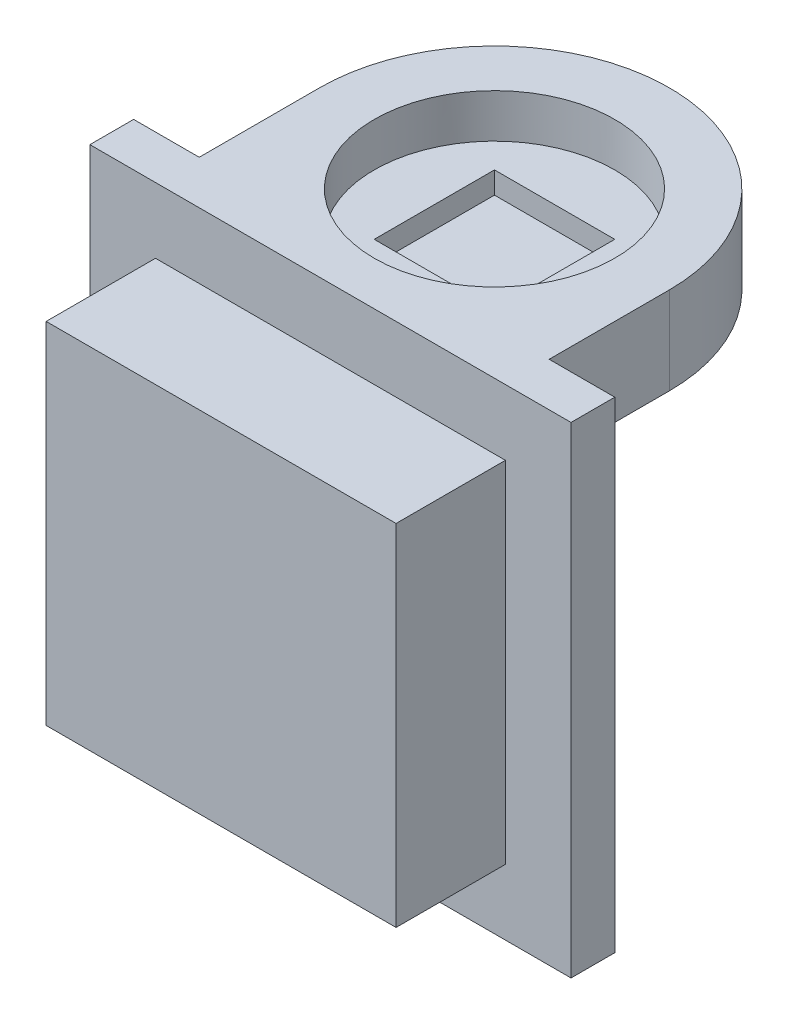
ISO-10303-21;
HEADER;
FILE_DESCRIPTION(('STEP AP214'),'2;1');
FILE_NAME('part.step','',(''),(''),'','','');
FILE_SCHEMA(('AUTOMOTIVE_DESIGN { 1 0 10303 214 1 1 1 1 }'));
ENDSEC;
DATA;
#1=APPLICATION_CONTEXT('core data for automotive mechanical design processes');
#2=APPLICATION_PROTOCOL_DEFINITION('international standard','automotive_design',2000,#1);
#3=PRODUCT_CONTEXT('',#1,'mechanical');
#4=PRODUCT('Part','Part','',(#3));
#5=PRODUCT_RELATED_PRODUCT_CATEGORY('part','',(#4));
#6=PRODUCT_DEFINITION_FORMATION('','',#4);
#7=PRODUCT_DEFINITION_CONTEXT('part definition',#1,'design');
#8=PRODUCT_DEFINITION('design','',#6,#7);
#9=PRODUCT_DEFINITION_SHAPE('','',#8);
#10=(LENGTH_UNIT() NAMED_UNIT(*) SI_UNIT(.MILLI.,.METRE.));
#11=(NAMED_UNIT(*) PLANE_ANGLE_UNIT() SI_UNIT($,.RADIAN.));
#12=(NAMED_UNIT(*) SI_UNIT($,.STERADIAN.) SOLID_ANGLE_UNIT());
#13=UNCERTAINTY_MEASURE_WITH_UNIT(LENGTH_MEASURE(1.E-05),#10,'distance_accuracy_value','');
#14=(GEOMETRIC_REPRESENTATION_CONTEXT(3) GLOBAL_UNCERTAINTY_ASSIGNED_CONTEXT((#13)) GLOBAL_UNIT_ASSIGNED_CONTEXT((#10,
#11,#12)) REPRESENTATION_CONTEXT('',''));
#15=CARTESIAN_POINT('',(0.,0.,0.));
#16=DIRECTION('',(0.,0.,1.));
#17=DIRECTION('',(1.,0.,0.));
#18=AXIS2_PLACEMENT_3D('',#15,#16,#17);
#19=CARTESIAN_POINT('',(2.75,9.,-13.75));
#20=DIRECTION('',(1.,0.,0.));
#21=DIRECTION('',(0.,0.,-1.));
#22=AXIS2_PLACEMENT_3D('',#19,#20,#21);
#23=PLANE('',#22);
#24=DIRECTION('',(0.,0.,1.));
#25=VECTOR('',#24,1.);
#26=CARTESIAN_POINT('',(2.75,8.,-13.75));
#27=LINE('',#26,#25);
#28=CARTESIAN_POINT('',(2.75,8.,-13.75));
#29=VERTEX_POINT('',#28);
#30=CARTESIAN_POINT('',(2.75,8.,-8.25));
#31=VERTEX_POINT('',#30);
#32=EDGE_CURVE('E193',#29,#31,#27,.T.);
#33=ORIENTED_EDGE('',*,*,#32,.T.);
#34=DIRECTION('',(0.,-1.,0.));
#35=VECTOR('',#34,1.);
#36=CARTESIAN_POINT('',(2.75,9.,-8.25));
#37=LINE('',#36,#35);
#38=CARTESIAN_POINT('',(2.75,9.,-8.25));
#39=VERTEX_POINT('',#38);
#40=EDGE_CURVE('E177',#39,#31,#37,.T.);
#41=ORIENTED_EDGE('',*,*,#40,.F.);
#42=DIRECTION('',(0.,0.,1.));
#43=VECTOR('',#42,1.);
#44=CARTESIAN_POINT('',(2.75,9.,-13.75));
#45=LINE('',#44,#43);
#46=CARTESIAN_POINT('',(2.75,9.,-13.75));
#47=VERTEX_POINT('',#46);
#48=EDGE_CURVE('E206',#47,#39,#45,.T.);
#49=ORIENTED_EDGE('',*,*,#48,.F.);
#50=DIRECTION('',(0.,-1.,0.));
#51=VECTOR('',#50,1.);
#52=CARTESIAN_POINT('',(2.75,9.,-13.75));
#53=LINE('',#52,#51);
#54=EDGE_CURVE('E194',#47,#29,#53,.T.);
#55=ORIENTED_EDGE('',*,*,#54,.T.);
#56=EDGE_LOOP('',(#33,#41,#49,#55));
#57=FACE_BOUND('',#56,.T.);
#58=ADVANCED_FACE('F39',(#57),#23,.F.);
#59=CARTESIAN_POINT('',(-2.75,9.,-13.75));
#60=DIRECTION('',(0.,0.,-1.));
#61=DIRECTION('',(-1.,0.,0.));
#62=AXIS2_PLACEMENT_3D('',#59,#60,#61);
#63=PLANE('',#62);
#64=DIRECTION('',(1.,0.,0.));
#65=VECTOR('',#64,1.);
#66=CARTESIAN_POINT('',(-2.75,8.,-13.75));
#67=LINE('',#66,#65);
#68=CARTESIAN_POINT('',(-2.75,8.,-13.75));
#69=VERTEX_POINT('',#68);
#70=EDGE_CURVE('E55',#69,#29,#67,.T.);
#71=ORIENTED_EDGE('',*,*,#70,.T.);
#72=ORIENTED_EDGE('',*,*,#54,.F.);
#73=DIRECTION('',(1.,0.,0.));
#74=VECTOR('',#73,1.);
#75=CARTESIAN_POINT('',(-2.75,9.,-13.75));
#76=LINE('',#75,#74);
#77=CARTESIAN_POINT('',(-2.75,9.,-13.75));
#78=VERTEX_POINT('',#77);
#79=EDGE_CURVE('E190',#78,#47,#76,.T.);
#80=ORIENTED_EDGE('',*,*,#79,.F.);
#81=DIRECTION('',(0.,-1.,0.));
#82=VECTOR('',#81,1.);
#83=CARTESIAN_POINT('',(-2.75,9.,-13.75));
#84=LINE('',#83,#82);
#85=EDGE_CURVE('E221',#78,#69,#84,.T.);
#86=ORIENTED_EDGE('',*,*,#85,.T.);
#87=EDGE_LOOP('',(#71,#72,#80,#86));
#88=FACE_BOUND('',#87,.T.);
#89=ADVANCED_FACE('F448',(#88),#63,.F.);
#90=CARTESIAN_POINT('',(-2.75,9.,-13.75));
#91=DIRECTION('',(-1.,0.,0.));
#92=DIRECTION('',(0.,0.,1.));
#93=AXIS2_PLACEMENT_3D('',#90,#91,#92);
#94=PLANE('',#93);
#95=DIRECTION('',(0.,0.,-1.));
#96=VECTOR('',#95,1.);
#97=CARTESIAN_POINT('',(-2.75,8.,-8.25));
#98=LINE('',#97,#96);
#99=CARTESIAN_POINT('',(-2.75,8.,-8.25));
#100=VERTEX_POINT('',#99);
#101=EDGE_CURVE('E63',#100,#69,#98,.T.);
#102=ORIENTED_EDGE('',*,*,#101,.T.);
#103=ORIENTED_EDGE('',*,*,#85,.F.);
#104=DIRECTION('',(0.,0.,-1.));
#105=VECTOR('',#104,1.);
#106=CARTESIAN_POINT('',(-2.75,9.,-13.75));
#107=LINE('',#106,#105);
#108=CARTESIAN_POINT('',(-2.75,9.,-8.25));
#109=VERTEX_POINT('',#108);
#110=EDGE_CURVE('E211',#109,#78,#107,.T.);
#111=ORIENTED_EDGE('',*,*,#110,.F.);
#112=DIRECTION('',(0.,-1.,0.));
#113=VECTOR('',#112,1.);
#114=CARTESIAN_POINT('',(-2.75,9.,-8.25));
#115=LINE('',#114,#113);
#116=EDGE_CURVE('E189',#109,#100,#115,.T.);
#117=ORIENTED_EDGE('',*,*,#116,.T.);
#118=EDGE_LOOP('',(#102,#103,#111,#117));
#119=FACE_BOUND('',#118,.T.);
#120=ADVANCED_FACE('F453',(#119),#94,.F.);
#121=CARTESIAN_POINT('',(-2.75,9.,-8.25));
#122=DIRECTION('',(0.,0.,1.));
#123=DIRECTION('',(1.,0.,0.));
#124=AXIS2_PLACEMENT_3D('',#121,#122,#123);
#125=PLANE('',#124);
#126=DIRECTION('',(-1.,0.,0.));
#127=VECTOR('',#126,1.);
#128=CARTESIAN_POINT('',(2.75,8.,-8.25));
#129=LINE('',#128,#127);
#130=EDGE_CURVE('E182',#31,#100,#129,.T.);
#131=ORIENTED_EDGE('',*,*,#130,.T.);
#132=ORIENTED_EDGE('',*,*,#116,.F.);
#133=DIRECTION('',(-1.,0.,0.));
#134=VECTOR('',#133,1.);
#135=CARTESIAN_POINT('',(-2.75,9.,-8.25));
#136=LINE('',#135,#134);
#137=EDGE_CURVE('E184',#39,#109,#136,.T.);
#138=ORIENTED_EDGE('',*,*,#137,.F.);
#139=ORIENTED_EDGE('',*,*,#40,.T.);
#140=EDGE_LOOP('',(#131,#132,#138,#139));
#141=FACE_BOUND('',#140,.T.);
#142=ADVANCED_FACE('F179',(#141),#125,.F.);
#143=CARTESIAN_POINT('',(0.,-15.2766694099455,-11.));
#144=DIRECTION('',(0.,1.,0.));
#145=DIRECTION('',(0.,0.,1.));
#146=AXIS2_PLACEMENT_3D('',#143,#144,#145);
#147=CYLINDRICAL_SURFACE('',#146,5.5);
#148=CARTESIAN_POINT('',(0.,11.,-11.));
#149=DIRECTION('',(0.,1.,0.));
#150=DIRECTION('',(0.,0.,1.));
#151=AXIS2_PLACEMENT_3D('',#148,#149,#150);
#152=CIRCLE('',#151,5.5);
#153=CARTESIAN_POINT('',(0.,11.,-5.5));
#154=VERTEX_POINT('',#153);
#155=EDGE_CURVE('E231',#154,#154,#152,.T.);
#156=ORIENTED_EDGE('',*,*,#155,.T.);
#157=EDGE_LOOP('',(#156));
#158=FACE_BOUND('',#157,.T.);
#159=CARTESIAN_POINT('',(0.,9.,-11.));
#160=DIRECTION('',(0.,-1.,0.));
#161=DIRECTION('',(0.,0.,-1.));
#162=AXIS2_PLACEMENT_3D('',#159,#160,#161);
#163=CIRCLE('',#162,5.5);
#164=CARTESIAN_POINT('',(0.,9.,-16.5));
#165=VERTEX_POINT('',#164);
#166=EDGE_CURVE('E11',#165,#165,#163,.F.);
#167=ORIENTED_EDGE('',*,*,#166,.F.);
#168=EDGE_LOOP('',(#167));
#169=FACE_BOUND('',#168,.T.);
#170=ADVANCED_FACE('F468',(#158,#169),#147,.F.);
#171=CARTESIAN_POINT('',(-7.,7.,-3.5));
#172=DIRECTION('',(0.,-1.,0.));
#173=DIRECTION('',(0.,0.,-1.));
#174=AXIS2_PLACEMENT_3D('',#171,#172,#173);
#175=PLANE('',#174);
#176=DIRECTION('',(1.,0.,0.));
#177=VECTOR('',#176,1.);
#178=CARTESIAN_POINT('',(-7.,7.,0.));
#179=LINE('',#178,#177);
#180=CARTESIAN_POINT('',(-7.,7.,0.));
#181=VERTEX_POINT('',#180);
#182=CARTESIAN_POINT('',(7.,7.,0.));
#183=VERTEX_POINT('',#182);
#184=EDGE_CURVE('E321',#181,#183,#179,.T.);
#185=ORIENTED_EDGE('',*,*,#184,.F.);
#186=DIRECTION('',(0.,0.,1.));
#187=VECTOR('',#186,1.);
#188=CARTESIAN_POINT('',(-7.,7.,-3.5));
#189=LINE('',#188,#187);
#190=CARTESIAN_POINT('',(-7.,7.,-5.5));
#191=VERTEX_POINT('',#190);
#192=EDGE_CURVE('E337',#191,#181,#189,.T.);
#193=ORIENTED_EDGE('',*,*,#192,.F.);
#194=DIRECTION('',(-1.,0.,0.));
#195=VECTOR('',#194,1.);
#196=CARTESIAN_POINT('',(0.,7.,-5.5));
#197=LINE('',#196,#195);
#198=CARTESIAN_POINT('',(-8.,7.,-5.5));
#199=VERTEX_POINT('',#198);
#200=EDGE_CURVE('E389',#191,#199,#197,.T.);
#201=ORIENTED_EDGE('',*,*,#200,.T.);
#202=DIRECTION('',(0.,0.,1.));
#203=VECTOR('',#202,1.);
#204=CARTESIAN_POINT('',(-8.,7.,-5.5));
#205=LINE('',#204,#203);
#206=CARTESIAN_POINT('',(-8.,7.,-11.));
#207=VERTEX_POINT('',#206);
#208=EDGE_CURVE('E220',#207,#199,#205,.T.);
#209=ORIENTED_EDGE('',*,*,#208,.F.);
#210=CARTESIAN_POINT('',(0.,7.,-11.));
#211=DIRECTION('',(0.,-1.,0.));
#212=DIRECTION('',(0.,0.,-1.));
#213=AXIS2_PLACEMENT_3D('',#210,#211,#212);
#214=CIRCLE('',#213,8.);
#215=CARTESIAN_POINT('',(8.,7.,-11.));
#216=VERTEX_POINT('',#215);
#217=EDGE_CURVE('E246',#216,#207,#214,.F.);
#218=ORIENTED_EDGE('',*,*,#217,.F.);
#219=DIRECTION('',(0.,0.,-1.));
#220=VECTOR('',#219,1.);
#221=CARTESIAN_POINT('',(8.,7.,-11.));
#222=LINE('',#221,#220);
#223=CARTESIAN_POINT('',(8.,7.,-5.5));
#224=VERTEX_POINT('',#223);
#225=EDGE_CURVE('E251',#224,#216,#222,.T.);
#226=ORIENTED_EDGE('',*,*,#225,.F.);
#227=CARTESIAN_POINT('',(7.,7.,-5.5));
#228=VERTEX_POINT('',#227);
#229=EDGE_CURVE('E48',#224,#228,#197,.T.);
#230=ORIENTED_EDGE('',*,*,#229,.T.);
#231=DIRECTION('',(0.,0.,1.));
#232=VECTOR('',#231,1.);
#233=CARTESIAN_POINT('',(7.,7.,-3.5));
#234=LINE('',#233,#232);
#235=EDGE_CURVE('E346',#228,#183,#234,.T.);
#236=ORIENTED_EDGE('',*,*,#235,.T.);
#237=EDGE_LOOP('',(#185,#193,#201,#209,#218,#226,#230,#236));
#238=FACE_BOUND('',#237,.T.);
#239=ADVANCED_FACE('F398',(#238),#175,.T.);
#240=CARTESIAN_POINT('',(7.,7.,-3.5));
#241=DIRECTION('',(-1.,0.,0.));
#242=DIRECTION('',(0.,0.,1.));
#243=AXIS2_PLACEMENT_3D('',#240,#241,#242);
#244=PLANE('',#243);
#245=DIRECTION('',(0.,-1.,0.));
#246=VECTOR('',#245,1.);
#247=CARTESIAN_POINT('',(7.,7.,0.));
#248=LINE('',#247,#246);
#249=CARTESIAN_POINT('',(7.,-7.,0.));
#250=VERTEX_POINT('',#249);
#251=EDGE_CURVE('E325',#183,#250,#248,.T.);
#252=ORIENTED_EDGE('',*,*,#251,.F.);
#253=ORIENTED_EDGE('',*,*,#235,.F.);
#254=DIRECTION('',(0.,-1.,0.));
#255=VECTOR('',#254,1.);
#256=CARTESIAN_POINT('',(7.,7.,-5.5));
#257=LINE('',#256,#255);
#258=CARTESIAN_POINT('',(7.,-7.,-5.5));
#259=VERTEX_POINT('',#258);
#260=EDGE_CURVE('E270',#228,#259,#257,.T.);
#261=ORIENTED_EDGE('',*,*,#260,.T.);
#262=DIRECTION('',(0.,0.,1.));
#263=VECTOR('',#262,1.);
#264=CARTESIAN_POINT('',(7.,-7.,-3.5));
#265=LINE('',#264,#263);
#266=EDGE_CURVE('E343',#259,#250,#265,.T.);
#267=ORIENTED_EDGE('',*,*,#266,.T.);
#268=EDGE_LOOP('',(#252,#253,#261,#267));
#269=FACE_BOUND('',#268,.T.);
#270=ADVANCED_FACE('F476',(#269),#244,.T.);
#271=CARTESIAN_POINT('',(7.,-7.,-3.5));
#272=DIRECTION('',(0.,1.,0.));
#273=DIRECTION('',(0.,0.,1.));
#274=AXIS2_PLACEMENT_3D('',#271,#272,#273);
#275=PLANE('',#274);
#276=DIRECTION('',(-1.,0.,0.));
#277=VECTOR('',#276,1.);
#278=CARTESIAN_POINT('',(7.,-7.,0.));
#279=LINE('',#278,#277);
#280=CARTESIAN_POINT('',(-7.,-7.,0.));
#281=VERTEX_POINT('',#280);
#282=EDGE_CURVE('E329',#250,#281,#279,.T.);
#283=ORIENTED_EDGE('',*,*,#282,.F.);
#284=ORIENTED_EDGE('',*,*,#266,.F.);
#285=DIRECTION('',(-1.,0.,0.));
#286=VECTOR('',#285,1.);
#287=CARTESIAN_POINT('',(7.,-7.,-5.5));
#288=LINE('',#287,#286);
#289=CARTESIAN_POINT('',(-7.,-7.,-5.5));
#290=VERTEX_POINT('',#289);
#291=EDGE_CURVE('E274',#259,#290,#288,.T.);
#292=ORIENTED_EDGE('',*,*,#291,.T.);
#293=DIRECTION('',(0.,0.,1.));
#294=VECTOR('',#293,1.);
#295=CARTESIAN_POINT('',(-7.,-7.,-3.5));
#296=LINE('',#295,#294);
#297=EDGE_CURVE('E340',#290,#281,#296,.T.);
#298=ORIENTED_EDGE('',*,*,#297,.T.);
#299=EDGE_LOOP('',(#283,#284,#292,#298));
#300=FACE_BOUND('',#299,.T.);
#301=ADVANCED_FACE('F498',(#300),#275,.T.);
#302=CARTESIAN_POINT('',(-7.,-7.,-3.5));
#303=DIRECTION('',(1.,0.,0.));
#304=DIRECTION('',(0.,0.,-1.));
#305=AXIS2_PLACEMENT_3D('',#302,#303,#304);
#306=PLANE('',#305);
#307=DIRECTION('',(0.,1.,0.));
#308=VECTOR('',#307,1.);
#309=CARTESIAN_POINT('',(-7.,-7.,0.));
#310=LINE('',#309,#308);
#311=EDGE_CURVE('E333',#281,#181,#310,.T.);
#312=ORIENTED_EDGE('',*,*,#311,.F.);
#313=ORIENTED_EDGE('',*,*,#297,.F.);
#314=DIRECTION('',(0.,1.,0.));
#315=VECTOR('',#314,1.);
#316=CARTESIAN_POINT('',(-7.,-7.,-5.5));
#317=LINE('',#316,#315);
#318=EDGE_CURVE('E266',#290,#191,#317,.T.);
#319=ORIENTED_EDGE('',*,*,#318,.T.);
#320=ORIENTED_EDGE('',*,*,#192,.T.);
#321=EDGE_LOOP('',(#312,#313,#319,#320));
#322=FACE_BOUND('',#321,.T.);
#323=ADVANCED_FACE('F495',(#322),#306,.T.);
#324=CARTESIAN_POINT('',(0.,0.,0.));
#325=DIRECTION('',(0.,0.,1.));
#326=DIRECTION('',(1.,0.,0.));
#327=AXIS2_PLACEMENT_3D('',#324,#325,#326);
#328=PLANE('',#327);
#329=ORIENTED_EDGE('',*,*,#311,.T.);
#330=ORIENTED_EDGE('',*,*,#184,.T.);
#331=ORIENTED_EDGE('',*,*,#251,.T.);
#332=ORIENTED_EDGE('',*,*,#282,.T.);
#333=EDGE_LOOP('',(#329,#330,#331,#332));
#334=FACE_BOUND('',#333,.T.);
#335=ADVANCED_FACE('F484',(#334),#328,.F.);
#336=CARTESIAN_POINT('',(0.,0.,-3.5));
#337=DIRECTION('',(0.,0.,-1.));
#338=DIRECTION('',(-1.,0.,0.));
#339=AXIS2_PLACEMENT_3D('',#336,#337,#338);
#340=PLANE('',#339);
#341=DIRECTION('',(0.,-1.,0.));
#342=VECTOR('',#341,1.);
#343=CARTESIAN_POINT('',(11.,11.,-3.5));
#344=LINE('',#343,#342);
#345=CARTESIAN_POINT('',(11.,11.,-3.5));
#346=VERTEX_POINT('',#345);
#347=CARTESIAN_POINT('',(11.,-11.,-3.5));
#348=VERTEX_POINT('',#347);
#349=EDGE_CURVE('E301',#346,#348,#344,.T.);
#350=ORIENTED_EDGE('',*,*,#349,.F.);
#351=DIRECTION('',(1.,0.,0.));
#352=VECTOR('',#351,1.);
#353=CARTESIAN_POINT('',(-11.,11.,-3.5));
#354=LINE('',#353,#352);
#355=CARTESIAN_POINT('',(-11.,11.,-3.5));
#356=VERTEX_POINT('',#355);
#357=EDGE_CURVE('E298',#356,#346,#354,.T.);
#358=ORIENTED_EDGE('',*,*,#357,.F.);
#359=DIRECTION('',(0.,1.,0.));
#360=VECTOR('',#359,1.);
#361=CARTESIAN_POINT('',(-11.,-11.,-3.5));
#362=LINE('',#361,#360);
#363=CARTESIAN_POINT('',(-11.,-11.,-3.5));
#364=VERTEX_POINT('',#363);
#365=EDGE_CURVE('E278',#364,#356,#362,.T.);
#366=ORIENTED_EDGE('',*,*,#365,.F.);
#367=DIRECTION('',(-1.,0.,0.));
#368=VECTOR('',#367,1.);
#369=CARTESIAN_POINT('',(11.,-11.,-3.5));
#370=LINE('',#369,#368);
#371=EDGE_CURVE('E284',#348,#364,#370,.T.);
#372=ORIENTED_EDGE('',*,*,#371,.F.);
#373=EDGE_LOOP('',(#350,#358,#366,#372));
#374=FACE_BOUND('',#373,.T.);
#375=DIRECTION('',(0.,1.,0.));
#376=VECTOR('',#375,1.);
#377=CARTESIAN_POINT('',(-8.,-8.,-3.5));
#378=LINE('',#377,#376);
#379=CARTESIAN_POINT('',(-8.,-8.,-3.5));
#380=VERTEX_POINT('',#379);
#381=CARTESIAN_POINT('',(-8.,8.,-3.5));
#382=VERTEX_POINT('',#381);
#383=EDGE_CURVE('E360',#380,#382,#378,.T.);
#384=ORIENTED_EDGE('',*,*,#383,.T.);
#385=DIRECTION('',(1.,0.,0.));
#386=VECTOR('',#385,1.);
#387=CARTESIAN_POINT('',(-8.,8.,-3.5));
#388=LINE('',#387,#386);
#389=CARTESIAN_POINT('',(8.,8.,-3.5));
#390=VERTEX_POINT('',#389);
#391=EDGE_CURVE('E349',#382,#390,#388,.T.);
#392=ORIENTED_EDGE('',*,*,#391,.T.);
#393=DIRECTION('',(0.,-1.,0.));
#394=VECTOR('',#393,1.);
#395=CARTESIAN_POINT('',(8.,8.,-3.5));
#396=LINE('',#395,#394);
#397=CARTESIAN_POINT('',(8.,-8.,-3.5));
#398=VERTEX_POINT('',#397);
#399=EDGE_CURVE('E353',#390,#398,#396,.T.);
#400=ORIENTED_EDGE('',*,*,#399,.T.);
#401=DIRECTION('',(-1.,0.,0.));
#402=VECTOR('',#401,1.);
#403=CARTESIAN_POINT('',(8.,-8.,-3.5));
#404=LINE('',#403,#402);
#405=EDGE_CURVE('E356',#398,#380,#404,.T.);
#406=ORIENTED_EDGE('',*,*,#405,.T.);
#407=EDGE_LOOP('',(#384,#392,#400,#406));
#408=FACE_BOUND('',#407,.T.);
#409=ADVANCED_FACE('F481',(#374,#408),#340,.F.);
#410=CARTESIAN_POINT('',(0.,0.,-5.5));
#411=DIRECTION('',(0.,0.,-1.));
#412=DIRECTION('',(-1.,0.,0.));
#413=AXIS2_PLACEMENT_3D('',#410,#411,#412);
#414=PLANE('',#413);
#415=DIRECTION('',(0.,-1.,0.));
#416=VECTOR('',#415,1.);
#417=CARTESIAN_POINT('',(8.,0.,-5.5));
#418=LINE('',#417,#416);
#419=CARTESIAN_POINT('',(8.,11.,-5.5));
#420=VERTEX_POINT('',#419);
#421=EDGE_CURVE('E236',#420,#224,#418,.T.);
#422=ORIENTED_EDGE('',*,*,#421,.F.);
#423=DIRECTION('',(1.,0.,0.));
#424=VECTOR('',#423,1.);
#425=CARTESIAN_POINT('',(-11.,11.,-5.5));
#426=LINE('',#425,#424);
#427=CARTESIAN_POINT('',(11.,11.,-5.5));
#428=VERTEX_POINT('',#427);
#429=EDGE_CURVE('E283',#420,#428,#426,.T.);
#430=ORIENTED_EDGE('',*,*,#429,.T.);
#431=DIRECTION('',(0.,-1.,0.));
#432=VECTOR('',#431,1.);
#433=CARTESIAN_POINT('',(11.,11.,-5.5));
#434=LINE('',#433,#432);
#435=CARTESIAN_POINT('',(11.,-11.,-5.5));
#436=VERTEX_POINT('',#435);
#437=EDGE_CURVE('E288',#428,#436,#434,.T.);
#438=ORIENTED_EDGE('',*,*,#437,.T.);
#439=DIRECTION('',(-1.,0.,0.));
#440=VECTOR('',#439,1.);
#441=CARTESIAN_POINT('',(11.,-11.,-5.5));
#442=LINE('',#441,#440);
#443=CARTESIAN_POINT('',(-11.,-11.,-5.5));
#444=VERTEX_POINT('',#443);
#445=EDGE_CURVE('E291',#436,#444,#442,.T.);
#446=ORIENTED_EDGE('',*,*,#445,.T.);
#447=DIRECTION('',(0.,1.,0.));
#448=VECTOR('',#447,1.);
#449=CARTESIAN_POINT('',(-11.,-11.,-5.5));
#450=LINE('',#449,#448);
#451=CARTESIAN_POINT('',(-11.,11.,-5.5));
#452=VERTEX_POINT('',#451);
#453=EDGE_CURVE('E279',#444,#452,#450,.T.);
#454=ORIENTED_EDGE('',*,*,#453,.T.);
#455=CARTESIAN_POINT('',(-8.,11.,-5.5));
#456=VERTEX_POINT('',#455);
#457=EDGE_CURVE('E285',#452,#456,#426,.T.);
#458=ORIENTED_EDGE('',*,*,#457,.T.);
#459=DIRECTION('',(0.,1.,0.));
#460=VECTOR('',#459,1.);
#461=CARTESIAN_POINT('',(-8.,0.,-5.5));
#462=LINE('',#461,#460);
#463=EDGE_CURVE('E262',#199,#456,#462,.T.);
#464=ORIENTED_EDGE('',*,*,#463,.F.);
#465=ORIENTED_EDGE('',*,*,#200,.F.);
#466=ORIENTED_EDGE('',*,*,#318,.F.);
#467=ORIENTED_EDGE('',*,*,#291,.F.);
#468=ORIENTED_EDGE('',*,*,#260,.F.);
#469=ORIENTED_EDGE('',*,*,#229,.F.);
#470=EDGE_LOOP('',(#422,#430,#438,#446,#454,#458,#464,#465,#466,#467,#468,#469));
#471=FACE_BOUND('',#470,.T.);
#472=ADVANCED_FACE('F403',(#471),#414,.T.);
#473=CARTESIAN_POINT('',(-11.,-11.,-5.5));
#474=DIRECTION('',(1.,0.,0.));
#475=DIRECTION('',(0.,1.,0.));
#476=AXIS2_PLACEMENT_3D('',#473,#474,#475);
#477=PLANE('',#476);
#478=ORIENTED_EDGE('',*,*,#365,.T.);
#479=DIRECTION('',(0.,0.,1.));
#480=VECTOR('',#479,1.);
#481=CARTESIAN_POINT('',(-11.,11.,-5.5));
#482=LINE('',#481,#480);
#483=EDGE_CURVE('E317',#452,#356,#482,.T.);
#484=ORIENTED_EDGE('',*,*,#483,.F.);
#485=ORIENTED_EDGE('',*,*,#453,.F.);
#486=DIRECTION('',(0.,0.,1.));
#487=VECTOR('',#486,1.);
#488=CARTESIAN_POINT('',(-11.,-11.,-5.5));
#489=LINE('',#488,#487);
#490=EDGE_CURVE('E294',#444,#364,#489,.T.);
#491=ORIENTED_EDGE('',*,*,#490,.T.);
#492=EDGE_LOOP('',(#478,#484,#485,#491));
#493=FACE_BOUND('',#492,.T.);
#494=ADVANCED_FACE('F431',(#493),#477,.F.);
#495=CARTESIAN_POINT('',(-11.,11.,-5.5));
#496=DIRECTION('',(0.,-1.,0.));
#497=DIRECTION('',(0.,0.,-1.));
#498=AXIS2_PLACEMENT_3D('',#495,#496,#497);
#499=PLANE('',#498);
#500=ORIENTED_EDGE('',*,*,#429,.F.);
#501=DIRECTION('',(0.,0.,-1.));
#502=VECTOR('',#501,1.);
#503=CARTESIAN_POINT('',(8.,11.,-11.));
#504=LINE('',#503,#502);
#505=CARTESIAN_POINT('',(8.,11.,-11.));
#506=VERTEX_POINT('',#505);
#507=EDGE_CURVE('E230',#420,#506,#504,.T.);
#508=ORIENTED_EDGE('',*,*,#507,.T.);
#509=CARTESIAN_POINT('',(0.,11.,-11.));
#510=DIRECTION('',(0.,1.,0.));
#511=DIRECTION('',(0.,0.,-1.));
#512=AXIS2_PLACEMENT_3D('',#509,#510,#511);
#513=CIRCLE('',#512,8.);
#514=CARTESIAN_POINT('',(-8.,11.,-11.));
#515=VERTEX_POINT('',#514);
#516=EDGE_CURVE('E232',#506,#515,#513,.T.);
#517=ORIENTED_EDGE('',*,*,#516,.T.);
#518=DIRECTION('',(0.,0.,1.));
#519=VECTOR('',#518,1.);
#520=CARTESIAN_POINT('',(-8.,11.,-5.5));
#521=LINE('',#520,#519);
#522=EDGE_CURVE('E226',#515,#456,#521,.T.);
#523=ORIENTED_EDGE('',*,*,#522,.T.);
#524=ORIENTED_EDGE('',*,*,#457,.F.);
#525=ORIENTED_EDGE('',*,*,#483,.T.);
#526=ORIENTED_EDGE('',*,*,#357,.T.);
#527=DIRECTION('',(0.,0.,1.));
#528=VECTOR('',#527,1.);
#529=CARTESIAN_POINT('',(11.,11.,-5.5));
#530=LINE('',#529,#528);
#531=EDGE_CURVE('E313',#428,#346,#530,.T.);
#532=ORIENTED_EDGE('',*,*,#531,.F.);
#533=EDGE_LOOP('',(#500,#508,#517,#523,#524,#525,#526,#532));
#534=FACE_BOUND('',#533,.T.);
#535=ORIENTED_EDGE('',*,*,#155,.F.);
#536=EDGE_LOOP('',(#535));
#537=FACE_BOUND('',#536,.T.);
#538=ADVANCED_FACE('F412',(#534,#537),#499,.F.);
#539=CARTESIAN_POINT('',(11.,11.,-5.5));
#540=DIRECTION('',(-1.,0.,0.));
#541=DIRECTION('',(0.,-1.,0.));
#542=AXIS2_PLACEMENT_3D('',#539,#540,#541);
#543=PLANE('',#542);
#544=ORIENTED_EDGE('',*,*,#349,.T.);
#545=DIRECTION('',(0.,0.,1.));
#546=VECTOR('',#545,1.);
#547=CARTESIAN_POINT('',(11.,-11.,-5.5));
#548=LINE('',#547,#546);
#549=EDGE_CURVE('E309',#436,#348,#548,.T.);
#550=ORIENTED_EDGE('',*,*,#549,.F.);
#551=ORIENTED_EDGE('',*,*,#437,.F.);
#552=ORIENTED_EDGE('',*,*,#531,.T.);
#553=EDGE_LOOP('',(#544,#550,#551,#552));
#554=FACE_BOUND('',#553,.T.);
#555=ADVANCED_FACE('F422',(#554),#543,.F.);
#556=CARTESIAN_POINT('',(11.,-11.,-5.5));
#557=DIRECTION('',(0.,1.,0.));
#558=DIRECTION('',(0.,0.,1.));
#559=AXIS2_PLACEMENT_3D('',#556,#557,#558);
#560=PLANE('',#559);
#561=ORIENTED_EDGE('',*,*,#371,.T.);
#562=ORIENTED_EDGE('',*,*,#490,.F.);
#563=ORIENTED_EDGE('',*,*,#445,.F.);
#564=ORIENTED_EDGE('',*,*,#549,.T.);
#565=EDGE_LOOP('',(#561,#562,#563,#564));
#566=FACE_BOUND('',#565,.T.);
#567=ADVANCED_FACE('F426',(#566),#560,.F.);
#568=CARTESIAN_POINT('',(0.,0.,1.5));
#569=DIRECTION('',(0.,0.,1.));
#570=DIRECTION('',(1.,0.,0.));
#571=AXIS2_PLACEMENT_3D('',#568,#569,#570);
#572=PLANE('',#571);
#573=DIRECTION('',(0.,1.,0.));
#574=VECTOR('',#573,1.);
#575=CARTESIAN_POINT('',(8.,8.,1.5));
#576=LINE('',#575,#574);
#577=CARTESIAN_POINT('',(8.,-8.,1.5));
#578=VERTEX_POINT('',#577);
#579=CARTESIAN_POINT('',(8.,8.,1.5));
#580=VERTEX_POINT('',#579);
#581=EDGE_CURVE('E363',#578,#580,#576,.T.);
#582=ORIENTED_EDGE('',*,*,#581,.T.);
#583=DIRECTION('',(-1.,0.,0.));
#584=VECTOR('',#583,1.);
#585=CARTESIAN_POINT('',(-8.,8.,1.5));
#586=LINE('',#585,#584);
#587=CARTESIAN_POINT('',(-8.,8.,1.5));
#588=VERTEX_POINT('',#587);
#589=EDGE_CURVE('E367',#580,#588,#586,.T.);
#590=ORIENTED_EDGE('',*,*,#589,.T.);
#591=DIRECTION('',(0.,-1.,0.));
#592=VECTOR('',#591,1.);
#593=CARTESIAN_POINT('',(-8.,8.,1.5));
#594=LINE('',#593,#592);
#595=CARTESIAN_POINT('',(-8.,-8.,1.5));
#596=VERTEX_POINT('',#595);
#597=EDGE_CURVE('E370',#588,#596,#594,.T.);
#598=ORIENTED_EDGE('',*,*,#597,.T.);
#599=DIRECTION('',(1.,0.,0.));
#600=VECTOR('',#599,1.);
#601=CARTESIAN_POINT('',(-8.,-8.,1.5));
#602=LINE('',#601,#600);
#603=EDGE_CURVE('E373',#596,#578,#602,.T.);
#604=ORIENTED_EDGE('',*,*,#603,.T.);
#605=EDGE_LOOP('',(#582,#590,#598,#604));
#606=FACE_BOUND('',#605,.T.);
#607=ADVANCED_FACE('F488',(#606),#572,.T.);
#608=CARTESIAN_POINT('',(-8.,8.,1.5));
#609=DIRECTION('',(1.,0.,0.));
#610=DIRECTION('',(0.,1.,0.));
#611=AXIS2_PLACEMENT_3D('',#608,#609,#610);
#612=PLANE('',#611);
#613=DIRECTION('',(0.,0.,-1.));
#614=VECTOR('',#613,1.);
#615=CARTESIAN_POINT('',(-8.,8.,1.5));
#616=LINE('',#615,#614);
#617=EDGE_CURVE('E383',#588,#382,#616,.T.);
#618=ORIENTED_EDGE('',*,*,#617,.T.);
#619=ORIENTED_EDGE('',*,*,#383,.F.);
#620=DIRECTION('',(0.,0.,-1.));
#621=VECTOR('',#620,1.);
#622=CARTESIAN_POINT('',(-8.,-8.,1.5));
#623=LINE('',#622,#621);
#624=EDGE_CURVE('E380',#596,#380,#623,.T.);
#625=ORIENTED_EDGE('',*,*,#624,.F.);
#626=ORIENTED_EDGE('',*,*,#597,.F.);
#627=EDGE_LOOP('',(#618,#619,#625,#626));
#628=FACE_BOUND('',#627,.T.);
#629=ADVANCED_FACE('F508',(#628),#612,.F.);
#630=CARTESIAN_POINT('',(-8.,-8.,1.5));
#631=DIRECTION('',(0.,1.,0.));
#632=DIRECTION('',(0.,0.,1.));
#633=AXIS2_PLACEMENT_3D('',#630,#631,#632);
#634=PLANE('',#633);
#635=ORIENTED_EDGE('',*,*,#624,.T.);
#636=ORIENTED_EDGE('',*,*,#405,.F.);
#637=DIRECTION('',(0.,0.,-1.));
#638=VECTOR('',#637,1.);
#639=CARTESIAN_POINT('',(8.,-8.,1.5));
#640=LINE('',#639,#638);
#641=EDGE_CURVE('E376',#578,#398,#640,.T.);
#642=ORIENTED_EDGE('',*,*,#641,.F.);
#643=ORIENTED_EDGE('',*,*,#603,.F.);
#644=EDGE_LOOP('',(#635,#636,#642,#643));
#645=FACE_BOUND('',#644,.T.);
#646=ADVANCED_FACE('F513',(#645),#634,.F.);
#647=CARTESIAN_POINT('',(8.,8.,1.5));
#648=DIRECTION('',(-1.,0.,0.));
#649=DIRECTION('',(0.,-1.,0.));
#650=AXIS2_PLACEMENT_3D('',#647,#648,#649);
#651=PLANE('',#650);
#652=ORIENTED_EDGE('',*,*,#641,.T.);
#653=ORIENTED_EDGE('',*,*,#399,.F.);
#654=DIRECTION('',(0.,0.,-1.));
#655=VECTOR('',#654,1.);
#656=CARTESIAN_POINT('',(8.,8.,1.5));
#657=LINE('',#656,#655);
#658=EDGE_CURVE('E387',#580,#390,#657,.T.);
#659=ORIENTED_EDGE('',*,*,#658,.F.);
#660=ORIENTED_EDGE('',*,*,#581,.F.);
#661=EDGE_LOOP('',(#652,#653,#659,#660));
#662=FACE_BOUND('',#661,.T.);
#663=ADVANCED_FACE('F41',(#662),#651,.F.);
#664=CARTESIAN_POINT('',(-8.,8.,1.5));
#665=DIRECTION('',(0.,-1.,0.));
#666=DIRECTION('',(0.,0.,-1.));
#667=AXIS2_PLACEMENT_3D('',#664,#665,#666);
#668=PLANE('',#667);
#669=ORIENTED_EDGE('',*,*,#658,.T.);
#670=ORIENTED_EDGE('',*,*,#391,.F.);
#671=ORIENTED_EDGE('',*,*,#617,.F.);
#672=ORIENTED_EDGE('',*,*,#589,.F.);
#673=EDGE_LOOP('',(#669,#670,#671,#672));
#674=FACE_BOUND('',#673,.T.);
#675=ADVANCED_FACE('F445',(#674),#668,.F.);
#676=CARTESIAN_POINT('',(-8.,-15.2766694099455,-5.5));
#677=DIRECTION('',(-1.,0.,0.));
#678=DIRECTION('',(0.,0.,1.));
#679=AXIS2_PLACEMENT_3D('',#676,#677,#678);
#680=PLANE('',#679);
#681=ORIENTED_EDGE('',*,*,#208,.T.);
#682=ORIENTED_EDGE('',*,*,#463,.T.);
#683=ORIENTED_EDGE('',*,*,#522,.F.);
#684=DIRECTION('',(0.,1.,0.));
#685=VECTOR('',#684,1.);
#686=CARTESIAN_POINT('',(-8.,-15.2766694099455,-11.));
#687=LINE('',#686,#685);
#688=EDGE_CURVE('E250',#207,#515,#687,.T.);
#689=ORIENTED_EDGE('',*,*,#688,.F.);
#690=EDGE_LOOP('',(#681,#682,#683,#689));
#691=FACE_BOUND('',#690,.T.);
#692=ADVANCED_FACE('F433',(#691),#680,.T.);
#693=CARTESIAN_POINT('',(0.,-15.2766694099455,-11.));
#694=DIRECTION('',(0.,1.,0.));
#695=DIRECTION('',(0.,0.,1.));
#696=AXIS2_PLACEMENT_3D('',#693,#694,#695);
#697=CYLINDRICAL_SURFACE('',#696,8.);
#698=DIRECTION('',(0.,1.,0.));
#699=VECTOR('',#698,1.);
#700=CARTESIAN_POINT('',(8.,-15.2766694099455,-11.));
#701=LINE('',#700,#699);
#702=EDGE_CURVE('E242',#216,#506,#701,.T.);
#703=ORIENTED_EDGE('',*,*,#702,.F.);
#704=ORIENTED_EDGE('',*,*,#217,.T.);
#705=ORIENTED_EDGE('',*,*,#688,.T.);
#706=ORIENTED_EDGE('',*,*,#516,.F.);
#707=EDGE_LOOP('',(#703,#704,#705,#706));
#708=FACE_BOUND('',#707,.T.);
#709=ADVANCED_FACE('F436',(#708),#697,.T.);
#710=CARTESIAN_POINT('',(8.,-15.2766694099455,-11.));
#711=DIRECTION('',(1.,0.,0.));
#712=DIRECTION('',(0.,0.,-1.));
#713=AXIS2_PLACEMENT_3D('',#710,#711,#712);
#714=PLANE('',#713);
#715=ORIENTED_EDGE('',*,*,#507,.F.);
#716=ORIENTED_EDGE('',*,*,#421,.T.);
#717=ORIENTED_EDGE('',*,*,#225,.T.);
#718=ORIENTED_EDGE('',*,*,#702,.T.);
#719=EDGE_LOOP('',(#715,#716,#717,#718));
#720=FACE_BOUND('',#719,.T.);
#721=ADVANCED_FACE('F408',(#720),#714,.T.);
#722=CARTESIAN_POINT('',(0.,9.,-11.));
#723=DIRECTION('',(0.,-1.,0.));
#724=DIRECTION('',(0.,0.,-1.));
#725=AXIS2_PLACEMENT_3D('',#722,#723,#724);
#726=PLANE('',#725);
#727=ORIENTED_EDGE('',*,*,#79,.T.);
#728=ORIENTED_EDGE('',*,*,#48,.T.);
#729=ORIENTED_EDGE('',*,*,#137,.T.);
#730=ORIENTED_EDGE('',*,*,#110,.T.);
#731=EDGE_LOOP('',(#727,#728,#729,#730));
#732=FACE_BOUND('',#731,.T.);
#733=ORIENTED_EDGE('',*,*,#166,.T.);
#734=EDGE_LOOP('',(#733));
#735=FACE_BOUND('',#734,.T.);
#736=ADVANCED_FACE('F443',(#732,#735),#726,.F.);
#737=CARTESIAN_POINT('',(0.,8.,0.));
#738=DIRECTION('',(0.,-1.,0.));
#739=DIRECTION('',(0.,0.,-1.));
#740=AXIS2_PLACEMENT_3D('',#737,#738,#739);
#741=PLANE('',#740);
#742=ORIENTED_EDGE('',*,*,#32,.F.);
#743=ORIENTED_EDGE('',*,*,#70,.F.);
#744=ORIENTED_EDGE('',*,*,#101,.F.);
#745=ORIENTED_EDGE('',*,*,#130,.F.);
#746=EDGE_LOOP('',(#742,#743,#744,#745));
#747=FACE_BOUND('',#746,.T.);
#748=ADVANCED_FACE('F198',(#747),#741,.F.);
#749=CLOSED_SHELL('',(#58,#89,#120,#142,#170,#239,#270,#301,#323,#335,#409,#472,#494,#538,#555,
#567,#607,#629,#646,#663,#675,#692,#709,#721,#736,#748));
#750=MANIFOLD_SOLID_BREP('B2',#749);
#751=ADVANCED_BREP_SHAPE_REPRESENTATION('',(#18,#750),#14);
#752=SHAPE_DEFINITION_REPRESENTATION(#9,#751);
ENDSEC;
END-ISO-10303-21;
